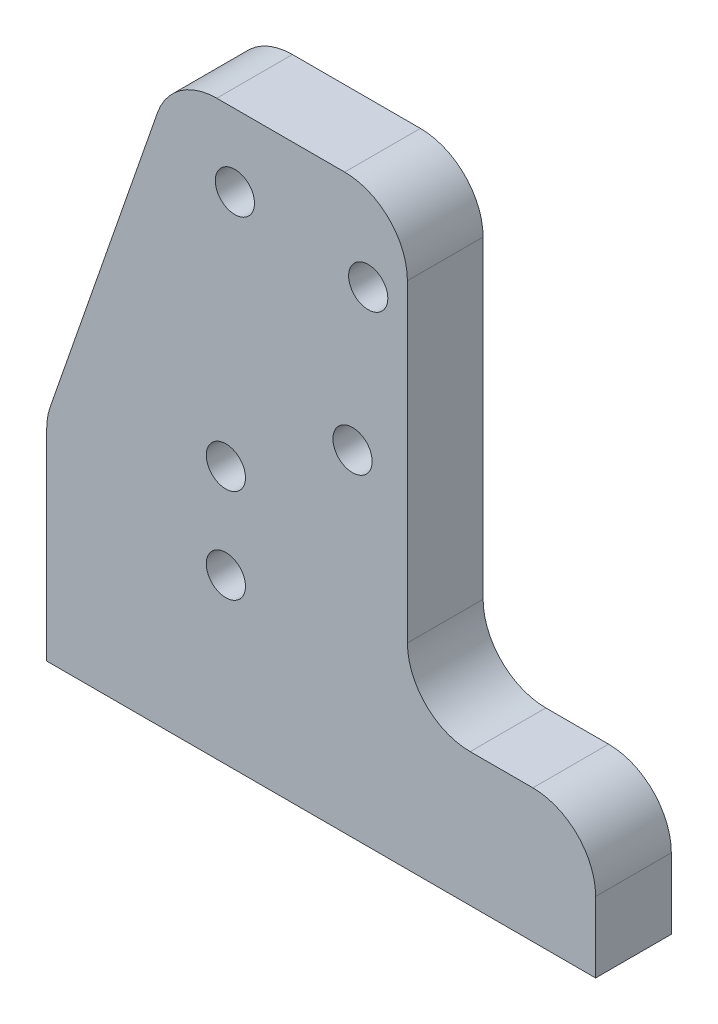
ISO-10303-21;
HEADER;
FILE_DESCRIPTION(('STEP AP214'),'2;1');
FILE_NAME('part.step','',(''),(''),'','','');
FILE_SCHEMA(('AUTOMOTIVE_DESIGN { 1 0 10303 214 1 1 1 1 }'));
ENDSEC;
DATA;
#1=APPLICATION_CONTEXT('core data for automotive mechanical design processes');
#2=APPLICATION_PROTOCOL_DEFINITION('international standard','automotive_design',2000,#1);
#3=PRODUCT_CONTEXT('',#1,'mechanical');
#4=PRODUCT('Part','Part','',(#3));
#5=PRODUCT_RELATED_PRODUCT_CATEGORY('part','',(#4));
#6=PRODUCT_DEFINITION_FORMATION('','',#4);
#7=PRODUCT_DEFINITION_CONTEXT('part definition',#1,'design');
#8=PRODUCT_DEFINITION('design','',#6,#7);
#9=PRODUCT_DEFINITION_SHAPE('','',#8);
#10=(LENGTH_UNIT() NAMED_UNIT(*) SI_UNIT(.MILLI.,.METRE.));
#11=(NAMED_UNIT(*) PLANE_ANGLE_UNIT() SI_UNIT($,.RADIAN.));
#12=(NAMED_UNIT(*) SI_UNIT($,.STERADIAN.) SOLID_ANGLE_UNIT());
#13=UNCERTAINTY_MEASURE_WITH_UNIT(LENGTH_MEASURE(1.E-05),#10,'distance_accuracy_value','');
#14=(GEOMETRIC_REPRESENTATION_CONTEXT(3) GLOBAL_UNCERTAINTY_ASSIGNED_CONTEXT((#13)) GLOBAL_UNIT_ASSIGNED_CONTEXT((#10,
#11,#12)) REPRESENTATION_CONTEXT('',''));
#15=CARTESIAN_POINT('',(0.,0.,0.));
#16=DIRECTION('',(0.,0.,1.));
#17=DIRECTION('',(1.,0.,0.));
#18=AXIS2_PLACEMENT_3D('',#15,#16,#17);
#19=CARTESIAN_POINT('',(0.,36.5,4.826));
#20=DIRECTION('',(0.,1.,0.));
#21=DIRECTION('',(0.,0.,-1.));
#22=AXIS2_PLACEMENT_3D('',#19,#20,#21);
#23=PLANE('',#22);
#24=DIRECTION('',(1.,0.,0.));
#25=VECTOR('',#24,1.);
#26=CARTESIAN_POINT('',(0.,36.5,9.652));
#27=LINE('',#26,#25);
#28=CARTESIAN_POINT('',(10.8437550128299,36.5,9.652));
#29=VERTEX_POINT('',#28);
#30=CARTESIAN_POINT('',(19.,36.5,9.652));
#31=VERTEX_POINT('',#30);
#32=EDGE_CURVE('E171',#29,#31,#27,.T.);
#33=ORIENTED_EDGE('',*,*,#32,.T.);
#34=DIRECTION('',(0.,0.,1.));
#35=VECTOR('',#34,1.);
#36=CARTESIAN_POINT('',(19.,36.5,4.826));
#37=LINE('',#36,#35);
#38=CARTESIAN_POINT('',(19.,36.5,4.826));
#39=VERTEX_POINT('',#38);
#40=EDGE_CURVE('E237',#39,#31,#37,.T.);
#41=ORIENTED_EDGE('',*,*,#40,.F.);
#42=DIRECTION('',(1.,0.,0.));
#43=VECTOR('',#42,1.);
#44=CARTESIAN_POINT('',(0.,36.5,4.826));
#45=LINE('',#44,#43);
#46=CARTESIAN_POINT('',(10.8437550128299,36.5,4.826));
#47=VERTEX_POINT('',#46);
#48=EDGE_CURVE('E172',#47,#39,#45,.T.);
#49=ORIENTED_EDGE('',*,*,#48,.F.);
#50=DIRECTION('',(0.,0.,1.));
#51=VECTOR('',#50,1.);
#52=CARTESIAN_POINT('',(10.8437550128299,36.5,4.826));
#53=LINE('',#52,#51);
#54=EDGE_CURVE('E240',#29,#47,#53,.F.);
#55=ORIENTED_EDGE('',*,*,#54,.F.);
#56=EDGE_LOOP('',(#33,#41,#49,#55));
#57=FACE_BOUND('',#56,.T.);
#58=ADVANCED_FACE('F49',(#57),#23,.T.);
#59=CARTESIAN_POINT('',(-4.18887015177066,1.45699831365936,4.826));
#60=DIRECTION('',(0.944496796706159,-0.328520624941273,0.));
#61=DIRECTION('',(0.328520624941273,0.944496796706159,0.));
#62=AXIS2_PLACEMENT_3D('',#59,#60,#61);
#63=PLANE('',#62);
#64=DIRECTION('',(-0.328520624941273,-0.944496796706159,0.));
#65=VECTOR('',#64,1.);
#66=CARTESIAN_POINT('',(-4.18887015177066,1.45699831365936,9.652));
#67=LINE('',#66,#65);
#68=CARTESIAN_POINT('',(7.06576782600525,33.8140824997651,9.652));
#69=VERTEX_POINT('',#68);
#70=CARTESIAN_POINT('',(0.222012813175365,14.1382868378792,9.652));
#71=VERTEX_POINT('',#70);
#72=EDGE_CURVE('E193',#69,#71,#67,.T.);
#73=ORIENTED_EDGE('',*,*,#72,.F.);
#74=DIRECTION('',(0.,0.,1.));
#75=VECTOR('',#74,1.);
#76=CARTESIAN_POINT('',(7.06576782600525,33.8140824997651,9.652));
#77=LINE('',#76,#75);
#78=CARTESIAN_POINT('',(7.06576782600525,33.8140824997651,4.826));
#79=VERTEX_POINT('',#78);
#80=EDGE_CURVE('E224',#79,#69,#77,.T.);
#81=ORIENTED_EDGE('',*,*,#80,.F.);
#82=DIRECTION('',(-0.328520624941273,-0.944496796706159,0.));
#83=VECTOR('',#82,1.);
#84=CARTESIAN_POINT('',(-4.18887015177066,1.45699831365936,4.826));
#85=LINE('',#84,#83);
#86=CARTESIAN_POINT('',(0.222012813175365,14.1382868378792,4.826));
#87=VERTEX_POINT('',#86);
#88=EDGE_CURVE('E174',#79,#87,#85,.T.);
#89=ORIENTED_EDGE('',*,*,#88,.T.);
#90=DIRECTION('',(0.,0.,1.));
#91=VECTOR('',#90,1.);
#92=CARTESIAN_POINT('',(0.222012813175365,14.1382868378792,4.826));
#93=LINE('',#92,#91);
#94=EDGE_CURVE('E227',#71,#87,#93,.F.);
#95=ORIENTED_EDGE('',*,*,#94,.F.);
#96=EDGE_LOOP('',(#73,#81,#89,#95));
#97=FACE_BOUND('',#96,.T.);
#98=ADVANCED_FACE('F284',(#97),#63,.F.);
#99=CARTESIAN_POINT('',(0.,0.,4.826));
#100=DIRECTION('',(-1.,0.,0.));
#101=DIRECTION('',(0.,0.,-1.));
#102=AXIS2_PLACEMENT_3D('',#99,#100,#101);
#103=PLANE('',#102);
#104=DIRECTION('',(0.,1.,0.));
#105=VECTOR('',#104,1.);
#106=CARTESIAN_POINT('',(0.,0.,4.826));
#107=LINE('',#106,#105);
#108=CARTESIAN_POINT('',(0.,0.,4.826));
#109=VERTEX_POINT('',#108);
#110=CARTESIAN_POINT('',(0.,12.8242043381141,4.826));
#111=VERTEX_POINT('',#110);
#112=EDGE_CURVE('E178',#109,#111,#107,.T.);
#113=ORIENTED_EDGE('',*,*,#112,.F.);
#114=DIRECTION('',(0.,0.,1.));
#115=VECTOR('',#114,1.);
#116=CARTESIAN_POINT('',(0.,0.,4.826));
#117=LINE('',#116,#115);
#118=CARTESIAN_POINT('',(0.,0.,9.652));
#119=VERTEX_POINT('',#118);
#120=EDGE_CURVE('E210',#109,#119,#117,.T.);
#121=ORIENTED_EDGE('',*,*,#120,.T.);
#122=DIRECTION('',(0.,1.,0.));
#123=VECTOR('',#122,1.);
#124=CARTESIAN_POINT('',(0.,0.,9.652));
#125=LINE('',#124,#123);
#126=CARTESIAN_POINT('',(0.,12.8242043381141,9.652));
#127=VERTEX_POINT('',#126);
#128=EDGE_CURVE('E196',#119,#127,#125,.T.);
#129=ORIENTED_EDGE('',*,*,#128,.T.);
#130=DIRECTION('',(0.,0.,1.));
#131=VECTOR('',#130,1.);
#132=CARTESIAN_POINT('',(0.,12.8242043381141,9.652));
#133=LINE('',#132,#131);
#134=EDGE_CURVE('E213',#111,#127,#133,.T.);
#135=ORIENTED_EDGE('',*,*,#134,.F.);
#136=EDGE_LOOP('',(#113,#121,#129,#135));
#137=FACE_BOUND('',#136,.T.);
#138=ADVANCED_FACE('F290',(#137),#103,.T.);
#139=CARTESIAN_POINT('',(0.,0.,4.826));
#140=DIRECTION('',(0.,-1.,0.));
#141=DIRECTION('',(1.,0.,0.));
#142=AXIS2_PLACEMENT_3D('',#139,#140,#141);
#143=PLANE('',#142);
#144=CARTESIAN_POINT('',(16.73,0.,7.239));
#145=DIRECTION('',(0.,1.,0.));
#146=DIRECTION('',(0.,0.,1.));
#147=AXIS2_PLACEMENT_3D('',#144,#145,#146);
#148=CIRCLE('',#147,1.24999999999999);
#149=CARTESIAN_POINT('',(16.73,0.,8.48899999999999));
#150=VERTEX_POINT('',#149);
#151=EDGE_CURVE('E153',#150,#150,#148,.T.);
#152=ORIENTED_EDGE('',*,*,#151,.T.);
#153=EDGE_LOOP('',(#152));
#154=FACE_BOUND('',#153,.T.);
#155=CARTESIAN_POINT('',(28.73,0.,7.239));
#156=DIRECTION('',(0.,1.,0.));
#157=DIRECTION('',(0.,0.,1.));
#158=AXIS2_PLACEMENT_3D('',#155,#156,#157);
#159=CIRCLE('',#158,1.24999999999999);
#160=CARTESIAN_POINT('',(28.73,0.,8.48899999999999));
#161=VERTEX_POINT('',#160);
#162=EDGE_CURVE('E152',#161,#161,#159,.T.);
#163=ORIENTED_EDGE('',*,*,#162,.T.);
#164=EDGE_LOOP('',(#163));
#165=FACE_BOUND('',#164,.T.);
#166=DIRECTION('',(-1.,0.,0.));
#167=VECTOR('',#166,1.);
#168=CARTESIAN_POINT('',(0.,0.,9.652));
#169=LINE('',#168,#167);
#170=CARTESIAN_POINT('',(35.,0.,9.652));
#171=VERTEX_POINT('',#170);
#172=EDGE_CURVE('E199',#171,#119,#169,.T.);
#173=ORIENTED_EDGE('',*,*,#172,.T.);
#174=ORIENTED_EDGE('',*,*,#120,.F.);
#175=DIRECTION('',(-1.,0.,0.));
#176=VECTOR('',#175,1.);
#177=CARTESIAN_POINT('',(0.,0.,4.826));
#178=LINE('',#177,#176);
#179=CARTESIAN_POINT('',(35.,0.,4.826));
#180=VERTEX_POINT('',#179);
#181=EDGE_CURVE('E181',#180,#109,#178,.T.);
#182=ORIENTED_EDGE('',*,*,#181,.F.);
#183=DIRECTION('',(0.,0.,1.));
#184=VECTOR('',#183,1.);
#185=CARTESIAN_POINT('',(35.,0.,4.826));
#186=LINE('',#185,#184);
#187=EDGE_CURVE('E190',#180,#171,#186,.T.);
#188=ORIENTED_EDGE('',*,*,#187,.T.);
#189=EDGE_LOOP('',(#173,#174,#182,#188));
#190=FACE_BOUND('',#189,.T.);
#191=ADVANCED_FACE('F294',(#154,#165,#190),#143,.T.);
#192=CARTESIAN_POINT('',(35.,0.,4.826));
#193=DIRECTION('',(1.,0.,0.));
#194=DIRECTION('',(0.,0.,1.));
#195=AXIS2_PLACEMENT_3D('',#192,#193,#194);
#196=PLANE('',#195);
#197=DIRECTION('',(0.,-1.,0.));
#198=VECTOR('',#197,1.);
#199=CARTESIAN_POINT('',(35.,0.,9.652));
#200=LINE('',#199,#198);
#201=CARTESIAN_POINT('',(35.,4.5,9.652));
#202=VERTEX_POINT('',#201);
#203=EDGE_CURVE('E201',#202,#171,#200,.T.);
#204=ORIENTED_EDGE('',*,*,#203,.T.);
#205=ORIENTED_EDGE('',*,*,#187,.F.);
#206=DIRECTION('',(0.,-1.,0.));
#207=VECTOR('',#206,1.);
#208=CARTESIAN_POINT('',(35.,0.,4.826));
#209=LINE('',#208,#207);
#210=CARTESIAN_POINT('',(35.,4.5,4.826));
#211=VERTEX_POINT('',#210);
#212=EDGE_CURVE('E183',#211,#180,#209,.T.);
#213=ORIENTED_EDGE('',*,*,#212,.F.);
#214=DIRECTION('',(0.,0.,1.));
#215=VECTOR('',#214,1.);
#216=CARTESIAN_POINT('',(35.,4.5,4.826));
#217=LINE('',#216,#215);
#218=EDGE_CURVE('E248',#202,#211,#217,.F.);
#219=ORIENTED_EDGE('',*,*,#218,.F.);
#220=EDGE_LOOP('',(#204,#205,#213,#219));
#221=FACE_BOUND('',#220,.T.);
#222=ADVANCED_FACE('F299',(#221),#196,.T.);
#223=CARTESIAN_POINT('',(0.,8.5,4.826));
#224=DIRECTION('',(0.,1.,0.));
#225=DIRECTION('',(0.,0.,-1.));
#226=AXIS2_PLACEMENT_3D('',#223,#224,#225);
#227=PLANE('',#226);
#228=DIRECTION('',(1.,0.,0.));
#229=VECTOR('',#228,1.);
#230=CARTESIAN_POINT('',(0.,8.5,4.826));
#231=LINE('',#230,#229);
#232=CARTESIAN_POINT('',(27.,8.5,4.826));
#233=VERTEX_POINT('',#232);
#234=CARTESIAN_POINT('',(31.,8.5,4.826));
#235=VERTEX_POINT('',#234);
#236=EDGE_CURVE('E185',#233,#235,#231,.T.);
#237=ORIENTED_EDGE('',*,*,#236,.F.);
#238=DIRECTION('',(0.,0.,1.));
#239=VECTOR('',#238,1.);
#240=CARTESIAN_POINT('',(27.,8.5,4.826));
#241=LINE('',#240,#239);
#242=CARTESIAN_POINT('',(27.,8.5,9.652));
#243=VERTEX_POINT('',#242);
#244=EDGE_CURVE('E243',#243,#233,#241,.F.);
#245=ORIENTED_EDGE('',*,*,#244,.F.);
#246=DIRECTION('',(1.,0.,0.));
#247=VECTOR('',#246,1.);
#248=CARTESIAN_POINT('',(0.,8.5,9.652));
#249=LINE('',#248,#247);
#250=CARTESIAN_POINT('',(31.,8.5,9.652));
#251=VERTEX_POINT('',#250);
#252=EDGE_CURVE('E203',#243,#251,#249,.T.);
#253=ORIENTED_EDGE('',*,*,#252,.T.);
#254=DIRECTION('',(0.,0.,1.));
#255=VECTOR('',#254,1.);
#256=CARTESIAN_POINT('',(31.,8.5,4.826));
#257=LINE('',#256,#255);
#258=EDGE_CURVE('E245',#235,#251,#257,.T.);
#259=ORIENTED_EDGE('',*,*,#258,.F.);
#260=EDGE_LOOP('',(#237,#245,#253,#259));
#261=FACE_BOUND('',#260,.T.);
#262=ADVANCED_FACE('F265',(#261),#227,.T.);
#263=CARTESIAN_POINT('',(23.,0.,4.826));
#264=DIRECTION('',(1.,0.,0.));
#265=DIRECTION('',(0.,1.,0.));
#266=AXIS2_PLACEMENT_3D('',#263,#264,#265);
#267=PLANE('',#266);
#268=DIRECTION('',(0.,-1.,0.));
#269=VECTOR('',#268,1.);
#270=CARTESIAN_POINT('',(23.,0.,4.826));
#271=LINE('',#270,#269);
#272=CARTESIAN_POINT('',(23.,32.5,4.826));
#273=VERTEX_POINT('',#272);
#274=CARTESIAN_POINT('',(23.,12.5,4.826));
#275=VERTEX_POINT('',#274);
#276=EDGE_CURVE('E188',#273,#275,#271,.T.);
#277=ORIENTED_EDGE('',*,*,#276,.F.);
#278=DIRECTION('',(0.,0.,1.));
#279=VECTOR('',#278,1.);
#280=CARTESIAN_POINT('',(23.,32.5,4.826));
#281=LINE('',#280,#279);
#282=CARTESIAN_POINT('',(23.,32.5,9.652));
#283=VERTEX_POINT('',#282);
#284=EDGE_CURVE('E251',#283,#273,#281,.F.);
#285=ORIENTED_EDGE('',*,*,#284,.F.);
#286=DIRECTION('',(0.,-1.,0.));
#287=VECTOR('',#286,1.);
#288=CARTESIAN_POINT('',(23.,0.,9.652));
#289=LINE('',#288,#287);
#290=CARTESIAN_POINT('',(23.,12.5,9.652));
#291=VERTEX_POINT('',#290);
#292=EDGE_CURVE('E175',#283,#291,#289,.T.);
#293=ORIENTED_EDGE('',*,*,#292,.T.);
#294=DIRECTION('',(0.,0.,1.));
#295=VECTOR('',#294,1.);
#296=CARTESIAN_POINT('',(23.,12.5,9.652));
#297=LINE('',#296,#295);
#298=EDGE_CURVE('E253',#275,#291,#297,.T.);
#299=ORIENTED_EDGE('',*,*,#298,.F.);
#300=EDGE_LOOP('',(#277,#285,#293,#299));
#301=FACE_BOUND('',#300,.T.);
#302=ADVANCED_FACE('F271',(#301),#267,.T.);
#303=CARTESIAN_POINT('',(0.,0.,4.826));
#304=DIRECTION('',(0.,0.,-1.));
#305=DIRECTION('',(1.,0.,0.));
#306=AXIS2_PLACEMENT_3D('',#303,#304,#305);
#307=PLANE('',#306);
#308=CARTESIAN_POINT('',(11.425,16.46,4.826));
#309=DIRECTION('',(0.,0.,1.));
#310=DIRECTION('',(1.,0.,0.));
#311=AXIS2_PLACEMENT_3D('',#308,#309,#310);
#312=CIRCLE('',#311,1.24999999999999);
#313=CARTESIAN_POINT('',(12.675,16.46,4.826));
#314=VERTEX_POINT('',#313);
#315=EDGE_CURVE('E610',#314,#314,#312,.T.);
#316=ORIENTED_EDGE('',*,*,#315,.T.);
#317=EDGE_LOOP('',(#316));
#318=FACE_BOUND('',#317,.T.);
#319=CARTESIAN_POINT('',(11.425,10.46,4.826));
#320=DIRECTION('',(0.,0.,1.));
#321=DIRECTION('',(1.,0.,0.));
#322=AXIS2_PLACEMENT_3D('',#319,#320,#321);
#323=CIRCLE('',#322,1.24999999999999);
#324=CARTESIAN_POINT('',(12.675,10.46,4.826));
#325=VERTEX_POINT('',#324);
#326=EDGE_CURVE('E612',#325,#325,#323,.T.);
#327=ORIENTED_EDGE('',*,*,#326,.T.);
#328=EDGE_LOOP('',(#327));
#329=FACE_BOUND('',#328,.T.);
#330=CARTESIAN_POINT('',(19.5,21.4,4.826));
#331=DIRECTION('',(0.,0.,1.));
#332=DIRECTION('',(1.,0.,0.));
#333=AXIS2_PLACEMENT_3D('',#330,#331,#332);
#334=CIRCLE('',#333,1.25);
#335=CARTESIAN_POINT('',(20.75,21.4,4.826));
#336=VERTEX_POINT('',#335);
#337=EDGE_CURVE('E620',#336,#336,#334,.T.);
#338=ORIENTED_EDGE('',*,*,#337,.T.);
#339=EDGE_LOOP('',(#338));
#340=FACE_BOUND('',#339,.T.);
#341=CARTESIAN_POINT('',(20.5,30.9,4.826));
#342=DIRECTION('',(0.,0.,1.));
#343=DIRECTION('',(1.,0.,0.));
#344=AXIS2_PLACEMENT_3D('',#341,#342,#343);
#345=CIRCLE('',#344,1.25);
#346=CARTESIAN_POINT('',(21.75,30.9,4.826));
#347=VERTEX_POINT('',#346);
#348=EDGE_CURVE('E626',#347,#347,#345,.T.);
#349=ORIENTED_EDGE('',*,*,#348,.T.);
#350=EDGE_LOOP('',(#349));
#351=FACE_BOUND('',#350,.T.);
#352=CARTESIAN_POINT('',(12.,31.9,4.826));
#353=DIRECTION('',(0.,0.,1.));
#354=DIRECTION('',(1.,0.,0.));
#355=AXIS2_PLACEMENT_3D('',#352,#353,#354);
#356=CIRCLE('',#355,1.25);
#357=CARTESIAN_POINT('',(13.25,31.9,4.826));
#358=VERTEX_POINT('',#357);
#359=EDGE_CURVE('E165',#358,#358,#356,.T.);
#360=ORIENTED_EDGE('',*,*,#359,.T.);
#361=EDGE_LOOP('',(#360));
#362=FACE_BOUND('',#361,.T.);
#363=ORIENTED_EDGE('',*,*,#88,.F.);
#364=CARTESIAN_POINT('',(10.8437550128299,32.5,4.826));
#365=DIRECTION('',(0.,0.,1.));
#366=DIRECTION('',(1.,0.,0.));
#367=AXIS2_PLACEMENT_3D('',#364,#365,#366);
#368=CIRCLE('',#367,4.);
#369=EDGE_CURVE('E233',#47,#79,#368,.T.);
#370=ORIENTED_EDGE('',*,*,#369,.F.);
#371=ORIENTED_EDGE('',*,*,#48,.T.);
#372=CARTESIAN_POINT('',(19.,32.5,4.826));
#373=DIRECTION('',(0.,0.,1.));
#374=DIRECTION('',(1.,0.,0.));
#375=AXIS2_PLACEMENT_3D('',#372,#373,#374);
#376=CIRCLE('',#375,4.);
#377=EDGE_CURVE('E70',#273,#39,#376,.T.);
#378=ORIENTED_EDGE('',*,*,#377,.F.);
#379=ORIENTED_EDGE('',*,*,#276,.T.);
#380=CARTESIAN_POINT('',(27.,12.5,4.826));
#381=DIRECTION('',(0.,0.,1.));
#382=DIRECTION('',(1.,0.,0.));
#383=AXIS2_PLACEMENT_3D('',#380,#381,#382);
#384=CIRCLE('',#383,4.);
#385=EDGE_CURVE('E11',#233,#275,#384,.F.);
#386=ORIENTED_EDGE('',*,*,#385,.F.);
#387=ORIENTED_EDGE('',*,*,#236,.T.);
#388=CARTESIAN_POINT('',(31.,4.5,4.826));
#389=DIRECTION('',(0.,0.,1.));
#390=DIRECTION('',(1.,0.,0.));
#391=AXIS2_PLACEMENT_3D('',#388,#389,#390);
#392=CIRCLE('',#391,4.);
#393=EDGE_CURVE('E231',#211,#235,#392,.T.);
#394=ORIENTED_EDGE('',*,*,#393,.F.);
#395=ORIENTED_EDGE('',*,*,#212,.T.);
#396=ORIENTED_EDGE('',*,*,#181,.T.);
#397=ORIENTED_EDGE('',*,*,#112,.T.);
#398=CARTESIAN_POINT('',(4.,12.8242043381141,4.826));
#399=DIRECTION('',(0.,0.,1.));
#400=DIRECTION('',(1.,0.,0.));
#401=AXIS2_PLACEMENT_3D('',#398,#399,#400);
#402=CIRCLE('',#401,4.);
#403=EDGE_CURVE('E235',#87,#111,#402,.T.);
#404=ORIENTED_EDGE('',*,*,#403,.F.);
#405=EDGE_LOOP('',(#363,#370,#371,#378,#379,#386,#387,#394,#395,#396,#397,#404));
#406=FACE_BOUND('',#405,.T.);
#407=ADVANCED_FACE('F267',(#318,#329,#340,#351,#362,#406),#307,.T.);
#408=CARTESIAN_POINT('',(0.,0.,9.652));
#409=DIRECTION('',(0.,0.,-1.));
#410=DIRECTION('',(1.,0.,0.));
#411=AXIS2_PLACEMENT_3D('',#408,#409,#410);
#412=PLANE('',#411);
#413=CARTESIAN_POINT('',(11.425,16.46,9.652));
#414=DIRECTION('',(0.,0.,1.));
#415=DIRECTION('',(1.,0.,0.));
#416=AXIS2_PLACEMENT_3D('',#413,#414,#415);
#417=CIRCLE('',#416,1.24999999999999);
#418=CARTESIAN_POINT('',(12.675,16.46,9.652));
#419=VERTEX_POINT('',#418);
#420=EDGE_CURVE('E607',#419,#419,#417,.T.);
#421=ORIENTED_EDGE('',*,*,#420,.F.);
#422=EDGE_LOOP('',(#421));
#423=FACE_BOUND('',#422,.T.);
#424=CARTESIAN_POINT('',(11.425,10.46,9.652));
#425=DIRECTION('',(0.,0.,1.));
#426=DIRECTION('',(1.,0.,0.));
#427=AXIS2_PLACEMENT_3D('',#424,#425,#426);
#428=CIRCLE('',#427,1.24999999999999);
#429=CARTESIAN_POINT('',(12.675,10.46,9.652));
#430=VERTEX_POINT('',#429);
#431=EDGE_CURVE('E617',#430,#430,#428,.T.);
#432=ORIENTED_EDGE('',*,*,#431,.F.);
#433=EDGE_LOOP('',(#432));
#434=FACE_BOUND('',#433,.T.);
#435=CARTESIAN_POINT('',(19.5,21.4,9.652));
#436=DIRECTION('',(0.,0.,1.));
#437=DIRECTION('',(1.,0.,0.));
#438=AXIS2_PLACEMENT_3D('',#435,#436,#437);
#439=CIRCLE('',#438,1.25);
#440=CARTESIAN_POINT('',(20.75,21.4,9.652));
#441=VERTEX_POINT('',#440);
#442=EDGE_CURVE('E623',#441,#441,#439,.T.);
#443=ORIENTED_EDGE('',*,*,#442,.F.);
#444=EDGE_LOOP('',(#443));
#445=FACE_BOUND('',#444,.T.);
#446=CARTESIAN_POINT('',(20.5,30.9,9.652));
#447=DIRECTION('',(0.,0.,1.));
#448=DIRECTION('',(1.,0.,0.));
#449=AXIS2_PLACEMENT_3D('',#446,#447,#448);
#450=CIRCLE('',#449,1.25);
#451=CARTESIAN_POINT('',(21.75,30.9,9.652));
#452=VERTEX_POINT('',#451);
#453=EDGE_CURVE('E159',#452,#452,#450,.T.);
#454=ORIENTED_EDGE('',*,*,#453,.F.);
#455=EDGE_LOOP('',(#454));
#456=FACE_BOUND('',#455,.T.);
#457=CARTESIAN_POINT('',(12.,31.9,9.652));
#458=DIRECTION('',(0.,0.,1.));
#459=DIRECTION('',(1.,0.,0.));
#460=AXIS2_PLACEMENT_3D('',#457,#458,#459);
#461=CIRCLE('',#460,1.25);
#462=CARTESIAN_POINT('',(13.25,31.9,9.652));
#463=VERTEX_POINT('',#462);
#464=EDGE_CURVE('E168',#463,#463,#461,.T.);
#465=ORIENTED_EDGE('',*,*,#464,.F.);
#466=EDGE_LOOP('',(#465));
#467=FACE_BOUND('',#466,.T.);
#468=ORIENTED_EDGE('',*,*,#128,.F.);
#469=ORIENTED_EDGE('',*,*,#172,.F.);
#470=ORIENTED_EDGE('',*,*,#203,.F.);
#471=CARTESIAN_POINT('',(31.,4.5,9.652));
#472=DIRECTION('',(0.,0.,1.));
#473=DIRECTION('',(1.,0.,0.));
#474=AXIS2_PLACEMENT_3D('',#471,#472,#473);
#475=CIRCLE('',#474,4.);
#476=EDGE_CURVE('E218',#251,#202,#475,.F.);
#477=ORIENTED_EDGE('',*,*,#476,.F.);
#478=ORIENTED_EDGE('',*,*,#252,.F.);
#479=CARTESIAN_POINT('',(27.,12.5,9.652));
#480=DIRECTION('',(0.,0.,1.));
#481=DIRECTION('',(1.,0.,0.));
#482=AXIS2_PLACEMENT_3D('',#479,#480,#481);
#483=CIRCLE('',#482,4.);
#484=EDGE_CURVE('E57',#291,#243,#483,.T.);
#485=ORIENTED_EDGE('',*,*,#484,.F.);
#486=ORIENTED_EDGE('',*,*,#292,.F.);
#487=CARTESIAN_POINT('',(19.,32.5,9.652));
#488=DIRECTION('',(0.,0.,1.));
#489=DIRECTION('',(1.,0.,0.));
#490=AXIS2_PLACEMENT_3D('',#487,#488,#489);
#491=CIRCLE('',#490,4.);
#492=EDGE_CURVE('E216',#31,#283,#491,.F.);
#493=ORIENTED_EDGE('',*,*,#492,.F.);
#494=ORIENTED_EDGE('',*,*,#32,.F.);
#495=CARTESIAN_POINT('',(10.8437550128299,32.5,9.652));
#496=DIRECTION('',(0.,0.,1.));
#497=DIRECTION('',(1.,0.,0.));
#498=AXIS2_PLACEMENT_3D('',#495,#496,#497);
#499=CIRCLE('',#498,4.);
#500=EDGE_CURVE('E220',#69,#29,#499,.F.);
#501=ORIENTED_EDGE('',*,*,#500,.F.);
#502=ORIENTED_EDGE('',*,*,#72,.T.);
#503=CARTESIAN_POINT('',(4.,12.8242043381141,9.652));
#504=DIRECTION('',(0.,0.,1.));
#505=DIRECTION('',(1.,0.,0.));
#506=AXIS2_PLACEMENT_3D('',#503,#504,#505);
#507=CIRCLE('',#506,4.);
#508=EDGE_CURVE('E222',#127,#71,#507,.F.);
#509=ORIENTED_EDGE('',*,*,#508,.F.);
#510=EDGE_LOOP('',(#468,#469,#470,#477,#478,#485,#486,#493,#494,#501,#502,#509));
#511=FACE_BOUND('',#510,.T.);
#512=ADVANCED_FACE('F261',(#423,#434,#445,#456,#467,#511),#412,.F.);
#513=CARTESIAN_POINT('',(12.,31.9,4.826));
#514=DIRECTION('',(0.,0.,-1.));
#515=DIRECTION('',(1.,0.,0.));
#516=AXIS2_PLACEMENT_3D('',#513,#514,#515);
#517=CYLINDRICAL_SURFACE('',#516,1.25);
#518=ORIENTED_EDGE('',*,*,#464,.T.);
#519=EDGE_LOOP('',(#518));
#520=FACE_BOUND('',#519,.T.);
#521=ORIENTED_EDGE('',*,*,#359,.F.);
#522=EDGE_LOOP('',(#521));
#523=FACE_BOUND('',#522,.T.);
#524=ADVANCED_FACE('F336',(#520,#523),#517,.F.);
#525=CARTESIAN_POINT('',(28.73,5.,7.239));
#526=DIRECTION('',(0.,-1.,0.));
#527=DIRECTION('',(0.,0.,1.));
#528=AXIS2_PLACEMENT_3D('',#525,#526,#527);
#529=CONICAL_SURFACE('',#528,1.25,1.02974425867665);
#530=CARTESIAN_POINT('',(28.73,5.75107577378445,7.239));
#531=VERTEX_POINT('',#530);
#532=VERTEX_LOOP('',#531);
#533=FACE_BOUND('',#532,.T.);
#534=CARTESIAN_POINT('',(28.73,5.,7.239));
#535=DIRECTION('',(0.,1.,0.));
#536=DIRECTION('',(0.,0.,1.));
#537=AXIS2_PLACEMENT_3D('',#534,#535,#536);
#538=CIRCLE('',#537,1.25);
#539=CARTESIAN_POINT('',(28.73,5.,8.489));
#540=VERTEX_POINT('',#539);
#541=EDGE_CURVE('E156',#540,#540,#538,.T.);
#542=ORIENTED_EDGE('',*,*,#541,.F.);
#543=EDGE_LOOP('',(#542));
#544=FACE_BOUND('',#543,.T.);
#545=ADVANCED_FACE('F332',(#533,#544),#529,.F.);
#546=CARTESIAN_POINT('',(28.73,0.,7.239));
#547=DIRECTION('',(0.,-1.,0.));
#548=DIRECTION('',(0.,0.,1.));
#549=AXIS2_PLACEMENT_3D('',#546,#547,#548);
#550=CYLINDRICAL_SURFACE('',#549,1.24999999999999);
#551=ORIENTED_EDGE('',*,*,#541,.T.);
#552=EDGE_LOOP('',(#551));
#553=FACE_BOUND('',#552,.T.);
#554=ORIENTED_EDGE('',*,*,#162,.F.);
#555=EDGE_LOOP('',(#554));
#556=FACE_BOUND('',#555,.T.);
#557=ADVANCED_FACE('F146',(#553,#556),#550,.F.);
#558=CARTESIAN_POINT('',(16.73,5.,7.239));
#559=DIRECTION('',(0.,-1.,0.));
#560=DIRECTION('',(0.,0.,1.));
#561=AXIS2_PLACEMENT_3D('',#558,#559,#560);
#562=CONICAL_SURFACE('',#561,1.25,1.02974425867665);
#563=CARTESIAN_POINT('',(16.73,5.75107577378445,7.239));
#564=VERTEX_POINT('',#563);
#565=VERTEX_LOOP('',#564);
#566=FACE_BOUND('',#565,.T.);
#567=CARTESIAN_POINT('',(16.73,5.,7.239));
#568=DIRECTION('',(0.,1.,0.));
#569=DIRECTION('',(0.,0.,1.));
#570=AXIS2_PLACEMENT_3D('',#567,#568,#569);
#571=CIRCLE('',#570,1.25);
#572=CARTESIAN_POINT('',(16.73,5.,8.489));
#573=VERTEX_POINT('',#572);
#574=EDGE_CURVE('E150',#573,#573,#571,.T.);
#575=ORIENTED_EDGE('',*,*,#574,.F.);
#576=EDGE_LOOP('',(#575));
#577=FACE_BOUND('',#576,.T.);
#578=ADVANCED_FACE('F142',(#566,#577),#562,.F.);
#579=CARTESIAN_POINT('',(16.73,0.,7.239));
#580=DIRECTION('',(0.,-1.,0.));
#581=DIRECTION('',(0.,0.,1.));
#582=AXIS2_PLACEMENT_3D('',#579,#580,#581);
#583=CYLINDRICAL_SURFACE('',#582,1.24999999999999);
#584=ORIENTED_EDGE('',*,*,#574,.T.);
#585=EDGE_LOOP('',(#584));
#586=FACE_BOUND('',#585,.T.);
#587=ORIENTED_EDGE('',*,*,#151,.F.);
#588=EDGE_LOOP('',(#587));
#589=FACE_BOUND('',#588,.T.);
#590=ADVANCED_FACE('F145',(#586,#589),#583,.F.);
#591=CARTESIAN_POINT('',(4.,12.8242043381141,4.826));
#592=DIRECTION('',(0.,0.,-1.));
#593=DIRECTION('',(1.,0.,0.));
#594=AXIS2_PLACEMENT_3D('',#591,#592,#593);
#595=CYLINDRICAL_SURFACE('',#594,4.);
#596=ORIENTED_EDGE('',*,*,#403,.T.);
#597=ORIENTED_EDGE('',*,*,#134,.T.);
#598=ORIENTED_EDGE('',*,*,#508,.T.);
#599=ORIENTED_EDGE('',*,*,#94,.T.);
#600=EDGE_LOOP('',(#596,#597,#598,#599));
#601=FACE_BOUND('',#600,.T.);
#602=ADVANCED_FACE('F286',(#601),#595,.T.);
#603=CARTESIAN_POINT('',(10.8437550128299,32.5,4.826));
#604=DIRECTION('',(0.,0.,-1.));
#605=DIRECTION('',(1.,0.,0.));
#606=AXIS2_PLACEMENT_3D('',#603,#604,#605);
#607=CYLINDRICAL_SURFACE('',#606,4.);
#608=ORIENTED_EDGE('',*,*,#369,.T.);
#609=ORIENTED_EDGE('',*,*,#80,.T.);
#610=ORIENTED_EDGE('',*,*,#500,.T.);
#611=ORIENTED_EDGE('',*,*,#54,.T.);
#612=EDGE_LOOP('',(#608,#609,#610,#611));
#613=FACE_BOUND('',#612,.T.);
#614=ADVANCED_FACE('F279',(#613),#607,.T.);
#615=CARTESIAN_POINT('',(31.,4.5,4.826));
#616=DIRECTION('',(0.,0.,1.));
#617=DIRECTION('',(-1.,0.,0.));
#618=AXIS2_PLACEMENT_3D('',#615,#616,#617);
#619=CYLINDRICAL_SURFACE('',#618,4.);
#620=ORIENTED_EDGE('',*,*,#393,.T.);
#621=ORIENTED_EDGE('',*,*,#258,.T.);
#622=ORIENTED_EDGE('',*,*,#476,.T.);
#623=ORIENTED_EDGE('',*,*,#218,.T.);
#624=EDGE_LOOP('',(#620,#621,#622,#623));
#625=FACE_BOUND('',#624,.T.);
#626=ADVANCED_FACE('F302',(#625),#619,.T.);
#627=CARTESIAN_POINT('',(27.,12.5,4.826));
#628=DIRECTION('',(0.,0.,-1.));
#629=DIRECTION('',(1.,0.,0.));
#630=AXIS2_PLACEMENT_3D('',#627,#628,#629);
#631=CYLINDRICAL_SURFACE('',#630,4.);
#632=ORIENTED_EDGE('',*,*,#385,.T.);
#633=ORIENTED_EDGE('',*,*,#298,.T.);
#634=ORIENTED_EDGE('',*,*,#484,.T.);
#635=ORIENTED_EDGE('',*,*,#244,.T.);
#636=EDGE_LOOP('',(#632,#633,#634,#635));
#637=FACE_BOUND('',#636,.T.);
#638=ADVANCED_FACE('F255',(#637),#631,.F.);
#639=CARTESIAN_POINT('',(19.,32.5,4.826));
#640=DIRECTION('',(0.,0.,1.));
#641=DIRECTION('',(-1.,0.,0.));
#642=AXIS2_PLACEMENT_3D('',#639,#640,#641);
#643=CYLINDRICAL_SURFACE('',#642,4.);
#644=ORIENTED_EDGE('',*,*,#377,.T.);
#645=ORIENTED_EDGE('',*,*,#40,.T.);
#646=ORIENTED_EDGE('',*,*,#492,.T.);
#647=ORIENTED_EDGE('',*,*,#284,.T.);
#648=EDGE_LOOP('',(#644,#645,#646,#647));
#649=FACE_BOUND('',#648,.T.);
#650=ADVANCED_FACE('F51',(#649),#643,.T.);
#651=CARTESIAN_POINT('',(20.5,30.9,4.826));
#652=DIRECTION('',(0.,0.,-1.));
#653=DIRECTION('',(1.,0.,0.));
#654=AXIS2_PLACEMENT_3D('',#651,#652,#653);
#655=CYLINDRICAL_SURFACE('',#654,1.25);
#656=ORIENTED_EDGE('',*,*,#453,.T.);
#657=EDGE_LOOP('',(#656));
#658=FACE_BOUND('',#657,.T.);
#659=ORIENTED_EDGE('',*,*,#348,.F.);
#660=EDGE_LOOP('',(#659));
#661=FACE_BOUND('',#660,.T.);
#662=ADVANCED_FACE('F327',(#658,#661),#655,.F.);
#663=CARTESIAN_POINT('',(19.5,21.4,4.826));
#664=DIRECTION('',(0.,0.,-1.));
#665=DIRECTION('',(1.,0.,0.));
#666=AXIS2_PLACEMENT_3D('',#663,#664,#665);
#667=CYLINDRICAL_SURFACE('',#666,1.25);
#668=ORIENTED_EDGE('',*,*,#442,.T.);
#669=EDGE_LOOP('',(#668));
#670=FACE_BOUND('',#669,.T.);
#671=ORIENTED_EDGE('',*,*,#337,.F.);
#672=EDGE_LOOP('',(#671));
#673=FACE_BOUND('',#672,.T.);
#674=ADVANCED_FACE('F451',(#670,#673),#667,.F.);
#675=CARTESIAN_POINT('',(11.425,10.46,4.826));
#676=DIRECTION('',(0.,0.,-1.));
#677=DIRECTION('',(1.,0.,0.));
#678=AXIS2_PLACEMENT_3D('',#675,#676,#677);
#679=CYLINDRICAL_SURFACE('',#678,1.24999999999999);
#680=ORIENTED_EDGE('',*,*,#431,.T.);
#681=EDGE_LOOP('',(#680));
#682=FACE_BOUND('',#681,.T.);
#683=ORIENTED_EDGE('',*,*,#326,.F.);
#684=EDGE_LOOP('',(#683));
#685=FACE_BOUND('',#684,.T.);
#686=ADVANCED_FACE('F463',(#682,#685),#679,.F.);
#687=CARTESIAN_POINT('',(11.425,16.46,4.826));
#688=DIRECTION('',(0.,0.,-1.));
#689=DIRECTION('',(1.,0.,0.));
#690=AXIS2_PLACEMENT_3D('',#687,#688,#689);
#691=CYLINDRICAL_SURFACE('',#690,1.24999999999999);
#692=ORIENTED_EDGE('',*,*,#420,.T.);
#693=EDGE_LOOP('',(#692));
#694=FACE_BOUND('',#693,.T.);
#695=ORIENTED_EDGE('',*,*,#315,.F.);
#696=EDGE_LOOP('',(#695));
#697=FACE_BOUND('',#696,.T.);
#698=ADVANCED_FACE('F477',(#694,#697),#691,.F.);
#699=CLOSED_SHELL('',(#58,#98,#138,#191,#222,#262,#302,#407,#512,#524,#545,#557,#578,#590,#602,
#614,#626,#638,#650,#662,#674,#686,#698));
#700=MANIFOLD_SOLID_BREP('B2',#699);
#701=ADVANCED_BREP_SHAPE_REPRESENTATION('',(#18,#700),#14);
#702=SHAPE_DEFINITION_REPRESENTATION(#9,#701);
ENDSEC;
END-ISO-10303-21;
